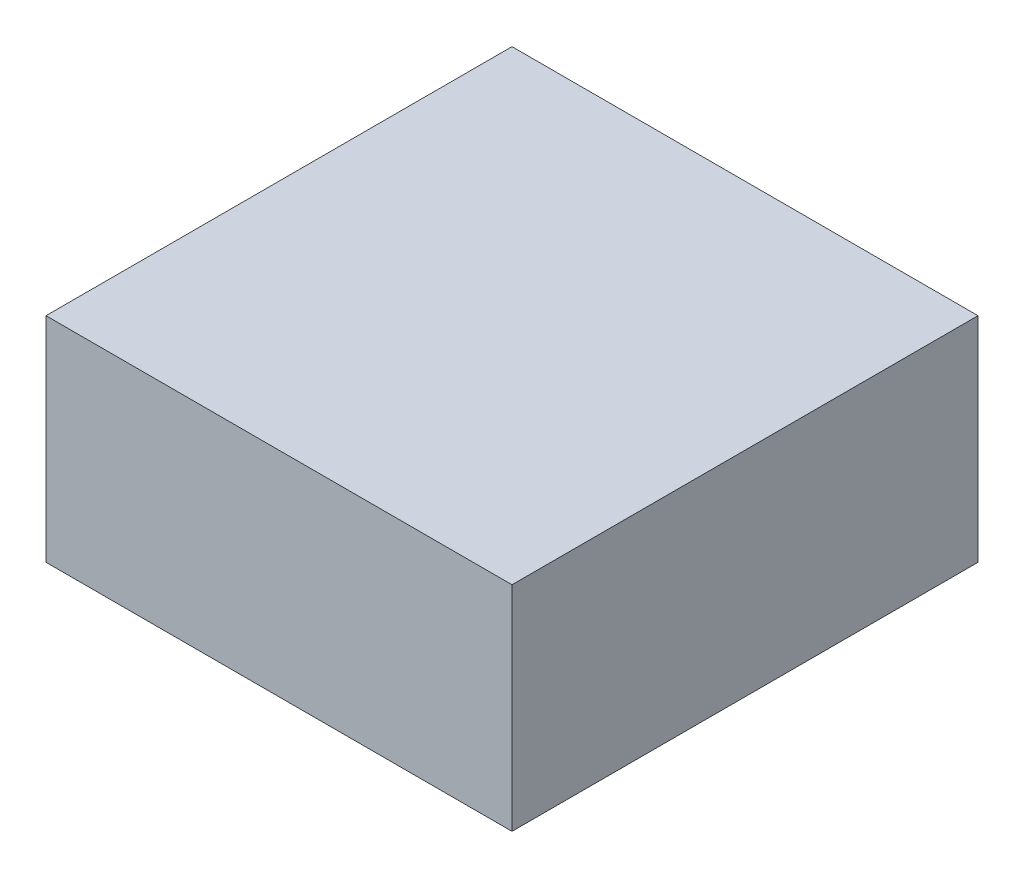
ISO-10303-21;
HEADER;
FILE_DESCRIPTION(('STEP AP214'),'2;1');
FILE_NAME('part.step','',(''),(''),'','','');
FILE_SCHEMA(('AUTOMOTIVE_DESIGN { 1 0 10303 214 1 1 1 1 }'));
ENDSEC;
DATA;
#1=APPLICATION_CONTEXT('core data for automotive mechanical design processes');
#2=APPLICATION_PROTOCOL_DEFINITION('international standard','automotive_design',2000,#1);
#3=PRODUCT_CONTEXT('',#1,'mechanical');
#4=PRODUCT('Part','Part','',(#3));
#5=PRODUCT_RELATED_PRODUCT_CATEGORY('part','',(#4));
#6=PRODUCT_DEFINITION_FORMATION('','',#4);
#7=PRODUCT_DEFINITION_CONTEXT('part definition',#1,'design');
#8=PRODUCT_DEFINITION('design','',#6,#7);
#9=PRODUCT_DEFINITION_SHAPE('','',#8);
#10=(LENGTH_UNIT() NAMED_UNIT(*) SI_UNIT(.MILLI.,.METRE.));
#11=(NAMED_UNIT(*) PLANE_ANGLE_UNIT() SI_UNIT($,.RADIAN.));
#12=(NAMED_UNIT(*) SI_UNIT($,.STERADIAN.) SOLID_ANGLE_UNIT());
#13=UNCERTAINTY_MEASURE_WITH_UNIT(LENGTH_MEASURE(1.E-05),#10,'distance_accuracy_value','');
#14=(GEOMETRIC_REPRESENTATION_CONTEXT(3) GLOBAL_UNCERTAINTY_ASSIGNED_CONTEXT((#13)) GLOBAL_UNIT_ASSIGNED_CONTEXT((#10,
#11,#12)) REPRESENTATION_CONTEXT('',''));
#15=CARTESIAN_POINT('',(0.,0.,0.));
#16=DIRECTION('',(0.,0.,1.));
#17=DIRECTION('',(1.,0.,0.));
#18=AXIS2_PLACEMENT_3D('',#15,#16,#17);
#19=CARTESIAN_POINT('',(0.,-2.7,0.));
#20=DIRECTION('',(0.,1.,0.));
#21=DIRECTION('',(0.,0.,1.));
#22=AXIS2_PLACEMENT_3D('',#19,#20,#21);
#23=PLANE('',#22);
#24=DIRECTION('',(-1.,0.,0.));
#25=VECTOR('',#24,1.);
#26=CARTESIAN_POINT('',(1.9,-2.7,1.9));
#27=LINE('',#26,#25);
#28=CARTESIAN_POINT('',(2.4,-2.7,1.9));
#29=VERTEX_POINT('',#28);
#30=CARTESIAN_POINT('',(1.9,-2.7,1.9));
#31=VERTEX_POINT('',#30);
#32=EDGE_CURVE('E63',#29,#31,#27,.T.);
#33=ORIENTED_EDGE('',*,*,#32,.F.);
#34=DIRECTION('',(0.,0.,1.));
#35=VECTOR('',#34,1.);
#36=CARTESIAN_POINT('',(2.4,-2.7,2.4));
#37=LINE('',#36,#35);
#38=CARTESIAN_POINT('',(2.4,-2.7,2.4));
#39=VERTEX_POINT('',#38);
#40=EDGE_CURVE('E237',#29,#39,#37,.T.);
#41=ORIENTED_EDGE('',*,*,#40,.T.);
#42=DIRECTION('',(-1.,0.,0.));
#43=VECTOR('',#42,1.);
#44=CARTESIAN_POINT('',(-2.4,-2.7,2.4));
#45=LINE('',#44,#43);
#46=CARTESIAN_POINT('',(-2.4,-2.7,2.4));
#47=VERTEX_POINT('',#46);
#48=EDGE_CURVE('E238',#39,#47,#45,.T.);
#49=ORIENTED_EDGE('',*,*,#48,.T.);
#50=DIRECTION('',(0.,0.,-1.));
#51=VECTOR('',#50,1.);
#52=CARTESIAN_POINT('',(-2.4,-2.7,-2.4));
#53=LINE('',#52,#51);
#54=CARTESIAN_POINT('',(-2.4,-2.7,1.9));
#55=VERTEX_POINT('',#54);
#56=EDGE_CURVE('E241',#47,#55,#53,.T.);
#57=ORIENTED_EDGE('',*,*,#56,.T.);
#58=DIRECTION('',(-1.,0.,0.));
#59=VECTOR('',#58,1.);
#60=CARTESIAN_POINT('',(-2.4,-2.7,1.9));
#61=LINE('',#60,#59);
#62=CARTESIAN_POINT('',(-1.9,-2.7,1.9));
#63=VERTEX_POINT('',#62);
#64=EDGE_CURVE('E209',#63,#55,#61,.T.);
#65=ORIENTED_EDGE('',*,*,#64,.F.);
#66=DIRECTION('',(0.,0.,1.));
#67=VECTOR('',#66,1.);
#68=CARTESIAN_POINT('',(-1.9,-2.7,1.9));
#69=LINE('',#68,#67);
#70=CARTESIAN_POINT('',(-1.9,-2.7,-1.9));
#71=VERTEX_POINT('',#70);
#72=EDGE_CURVE('E199',#71,#63,#69,.T.);
#73=ORIENTED_EDGE('',*,*,#72,.F.);
#74=DIRECTION('',(1.,0.,0.));
#75=VECTOR('',#74,1.);
#76=CARTESIAN_POINT('',(-1.9,-2.7,-1.9));
#77=LINE('',#76,#75);
#78=CARTESIAN_POINT('',(-2.4,-2.7,-1.9));
#79=VERTEX_POINT('',#78);
#80=EDGE_CURVE('E197',#79,#71,#77,.T.);
#81=ORIENTED_EDGE('',*,*,#80,.F.);
#82=CARTESIAN_POINT('',(-2.4,-2.7,-2.4));
#83=VERTEX_POINT('',#82);
#84=EDGE_CURVE('E245',#79,#83,#53,.T.);
#85=ORIENTED_EDGE('',*,*,#84,.T.);
#86=DIRECTION('',(1.,0.,0.));
#87=VECTOR('',#86,1.);
#88=CARTESIAN_POINT('',(2.4,-2.7,-2.4));
#89=LINE('',#88,#87);
#90=CARTESIAN_POINT('',(2.4,-2.7,-2.4));
#91=VERTEX_POINT('',#90);
#92=EDGE_CURVE('E235',#83,#91,#89,.T.);
#93=ORIENTED_EDGE('',*,*,#92,.T.);
#94=CARTESIAN_POINT('',(2.4,-2.7,-1.9));
#95=VERTEX_POINT('',#94);
#96=EDGE_CURVE('E236',#91,#95,#37,.T.);
#97=ORIENTED_EDGE('',*,*,#96,.T.);
#98=DIRECTION('',(1.,0.,0.));
#99=VECTOR('',#98,1.);
#100=CARTESIAN_POINT('',(2.4,-2.7,-1.9));
#101=LINE('',#100,#99);
#102=CARTESIAN_POINT('',(1.9,-2.7,-1.9));
#103=VERTEX_POINT('',#102);
#104=EDGE_CURVE('E191',#103,#95,#101,.T.);
#105=ORIENTED_EDGE('',*,*,#104,.F.);
#106=DIRECTION('',(0.,0.,-1.));
#107=VECTOR('',#106,1.);
#108=CARTESIAN_POINT('',(1.9,-2.7,-1.9));
#109=LINE('',#108,#107);
#110=EDGE_CURVE('E57',#31,#103,#109,.T.);
#111=ORIENTED_EDGE('',*,*,#110,.F.);
#112=EDGE_LOOP('',(#33,#41,#49,#57,#65,#73,#81,#85,#93,#97,#105,#111));
#113=FACE_BOUND('',#112,.T.);
#114=ADVANCED_FACE('F39',(#113),#23,.F.);
#115=CARTESIAN_POINT('',(0.,-0.5,0.));
#116=DIRECTION('',(0.,-1.,0.));
#117=DIRECTION('',(0.,0.,-1.));
#118=AXIS2_PLACEMENT_3D('',#115,#116,#117);
#119=PLANE('',#118);
#120=DIRECTION('',(0.,0.,1.));
#121=VECTOR('',#120,1.);
#122=CARTESIAN_POINT('',(5.5,-0.5,-5.5));
#123=LINE('',#122,#121);
#124=CARTESIAN_POINT('',(5.5,-0.5,-5.5));
#125=VERTEX_POINT('',#124);
#126=CARTESIAN_POINT('',(5.5,-0.5,5.5));
#127=VERTEX_POINT('',#126);
#128=EDGE_CURVE('E262',#125,#127,#123,.T.);
#129=ORIENTED_EDGE('',*,*,#128,.T.);
#130=DIRECTION('',(-1.,0.,0.));
#131=VECTOR('',#130,1.);
#132=CARTESIAN_POINT('',(5.5,-0.5,5.5));
#133=LINE('',#132,#131);
#134=CARTESIAN_POINT('',(-5.5,-0.5,5.5));
#135=VERTEX_POINT('',#134);
#136=EDGE_CURVE('E270',#127,#135,#133,.T.);
#137=ORIENTED_EDGE('',*,*,#136,.T.);
#138=DIRECTION('',(0.,0.,-1.));
#139=VECTOR('',#138,1.);
#140=CARTESIAN_POINT('',(-5.5,-0.5,5.5));
#141=LINE('',#140,#139);
#142=CARTESIAN_POINT('',(-5.5,-0.5,-5.5));
#143=VERTEX_POINT('',#142);
#144=EDGE_CURVE('E271',#135,#143,#141,.T.);
#145=ORIENTED_EDGE('',*,*,#144,.T.);
#146=DIRECTION('',(1.,0.,0.));
#147=VECTOR('',#146,1.);
#148=CARTESIAN_POINT('',(-5.5,-0.5,-5.5));
#149=LINE('',#148,#147);
#150=EDGE_CURVE('E273',#143,#125,#149,.T.);
#151=ORIENTED_EDGE('',*,*,#150,.T.);
#152=EDGE_LOOP('',(#129,#137,#145,#151));
#153=FACE_BOUND('',#152,.T.);
#154=DIRECTION('',(0.,0.,1.));
#155=VECTOR('',#154,1.);
#156=CARTESIAN_POINT('',(2.4,-0.5,2.4));
#157=LINE('',#156,#155);
#158=CARTESIAN_POINT('',(2.4,-0.5,-2.4));
#159=VERTEX_POINT('',#158);
#160=CARTESIAN_POINT('',(2.4,-0.5,2.4));
#161=VERTEX_POINT('',#160);
#162=EDGE_CURVE('E250',#159,#161,#157,.T.);
#163=ORIENTED_EDGE('',*,*,#162,.F.);
#164=DIRECTION('',(1.,0.,0.));
#165=VECTOR('',#164,1.);
#166=CARTESIAN_POINT('',(2.4,-0.5,-2.4));
#167=LINE('',#166,#165);
#168=CARTESIAN_POINT('',(-2.4,-0.5,-2.4));
#169=VERTEX_POINT('',#168);
#170=EDGE_CURVE('E234',#169,#159,#167,.T.);
#171=ORIENTED_EDGE('',*,*,#170,.F.);
#172=DIRECTION('',(0.,0.,-1.));
#173=VECTOR('',#172,1.);
#174=CARTESIAN_POINT('',(-2.4,-0.5,-2.4));
#175=LINE('',#174,#173);
#176=CARTESIAN_POINT('',(-2.4,-0.5,2.4));
#177=VERTEX_POINT('',#176);
#178=EDGE_CURVE('E240',#177,#169,#175,.T.);
#179=ORIENTED_EDGE('',*,*,#178,.F.);
#180=DIRECTION('',(-1.,0.,0.));
#181=VECTOR('',#180,1.);
#182=CARTESIAN_POINT('',(-2.4,-0.5,2.4));
#183=LINE('',#182,#181);
#184=EDGE_CURVE('E248',#161,#177,#183,.T.);
#185=ORIENTED_EDGE('',*,*,#184,.F.);
#186=EDGE_LOOP('',(#163,#171,#179,#185));
#187=FACE_BOUND('',#186,.T.);
#188=ADVANCED_FACE('F350',(#153,#187),#119,.T.);
#189=CARTESIAN_POINT('',(6.,-5.5,-6.));
#190=DIRECTION('',(0.,0.,-1.));
#191=DIRECTION('',(-1.,0.,0.));
#192=AXIS2_PLACEMENT_3D('',#189,#190,#191);
#193=PLANE('',#192);
#194=DIRECTION('',(-1.,0.,0.));
#195=VECTOR('',#194,1.);
#196=CARTESIAN_POINT('',(6.,0.,-6.));
#197=LINE('',#196,#195);
#198=CARTESIAN_POINT('',(6.,0.,-6.));
#199=VERTEX_POINT('',#198);
#200=CARTESIAN_POINT('',(-6.,0.,-6.));
#201=VERTEX_POINT('',#200);
#202=EDGE_CURVE('E286',#199,#201,#197,.T.);
#203=ORIENTED_EDGE('',*,*,#202,.F.);
#204=DIRECTION('',(0.,1.,0.));
#205=VECTOR('',#204,1.);
#206=CARTESIAN_POINT('',(6.,-5.5,-6.));
#207=LINE('',#206,#205);
#208=CARTESIAN_POINT('',(6.,-5.5,-6.));
#209=VERTEX_POINT('',#208);
#210=EDGE_CURVE('E11',#209,#199,#207,.T.);
#211=ORIENTED_EDGE('',*,*,#210,.F.);
#212=DIRECTION('',(-1.,0.,0.));
#213=VECTOR('',#212,1.);
#214=CARTESIAN_POINT('',(6.,-5.5,-6.));
#215=LINE('',#214,#213);
#216=CARTESIAN_POINT('',(-6.,-5.5,-6.));
#217=VERTEX_POINT('',#216);
#218=EDGE_CURVE('E298',#209,#217,#215,.T.);
#219=ORIENTED_EDGE('',*,*,#218,.T.);
#220=DIRECTION('',(0.,1.,0.));
#221=VECTOR('',#220,1.);
#222=CARTESIAN_POINT('',(-6.,-5.5,-6.));
#223=LINE('',#222,#221);
#224=EDGE_CURVE('E43',#217,#201,#223,.T.);
#225=ORIENTED_EDGE('',*,*,#224,.T.);
#226=EDGE_LOOP('',(#203,#211,#219,#225));
#227=FACE_BOUND('',#226,.T.);
#228=ADVANCED_FACE('F41',(#227),#193,.T.);
#229=CARTESIAN_POINT('',(6.,-5.5,6.));
#230=DIRECTION('',(1.,0.,0.));
#231=DIRECTION('',(0.,0.,-1.));
#232=AXIS2_PLACEMENT_3D('',#229,#230,#231);
#233=PLANE('',#232);
#234=DIRECTION('',(0.,0.,-1.));
#235=VECTOR('',#234,1.);
#236=CARTESIAN_POINT('',(6.,0.,6.));
#237=LINE('',#236,#235);
#238=CARTESIAN_POINT('',(6.,0.,6.));
#239=VERTEX_POINT('',#238);
#240=EDGE_CURVE('E297',#239,#199,#237,.T.);
#241=ORIENTED_EDGE('',*,*,#240,.F.);
#242=DIRECTION('',(0.,1.,0.));
#243=VECTOR('',#242,1.);
#244=CARTESIAN_POINT('',(6.,-5.5,6.));
#245=LINE('',#244,#243);
#246=CARTESIAN_POINT('',(6.,-5.5,6.));
#247=VERTEX_POINT('',#246);
#248=EDGE_CURVE('E48',#247,#239,#245,.T.);
#249=ORIENTED_EDGE('',*,*,#248,.F.);
#250=DIRECTION('',(0.,0.,-1.));
#251=VECTOR('',#250,1.);
#252=CARTESIAN_POINT('',(6.,-5.5,6.));
#253=LINE('',#252,#251);
#254=EDGE_CURVE('E308',#247,#209,#253,.T.);
#255=ORIENTED_EDGE('',*,*,#254,.T.);
#256=ORIENTED_EDGE('',*,*,#210,.T.);
#257=EDGE_LOOP('',(#241,#249,#255,#256));
#258=FACE_BOUND('',#257,.T.);
#259=ADVANCED_FACE('F335',(#258),#233,.T.);
#260=CARTESIAN_POINT('',(-6.,-5.5,6.));
#261=DIRECTION('',(0.,0.,1.));
#262=DIRECTION('',(1.,0.,0.));
#263=AXIS2_PLACEMENT_3D('',#260,#261,#262);
#264=PLANE('',#263);
#265=DIRECTION('',(1.,0.,0.));
#266=VECTOR('',#265,1.);
#267=CARTESIAN_POINT('',(-6.,0.,6.));
#268=LINE('',#267,#266);
#269=CARTESIAN_POINT('',(-6.,0.,6.));
#270=VERTEX_POINT('',#269);
#271=EDGE_CURVE('E314',#270,#239,#268,.T.);
#272=ORIENTED_EDGE('',*,*,#271,.F.);
#273=DIRECTION('',(0.,1.,0.));
#274=VECTOR('',#273,1.);
#275=CARTESIAN_POINT('',(-6.,-5.5,6.));
#276=LINE('',#275,#274);
#277=CARTESIAN_POINT('',(-6.,-5.5,6.));
#278=VERTEX_POINT('',#277);
#279=EDGE_CURVE('E317',#278,#270,#276,.T.);
#280=ORIENTED_EDGE('',*,*,#279,.F.);
#281=DIRECTION('',(1.,0.,0.));
#282=VECTOR('',#281,1.);
#283=CARTESIAN_POINT('',(-6.,-5.5,6.));
#284=LINE('',#283,#282);
#285=EDGE_CURVE('E305',#278,#247,#284,.T.);
#286=ORIENTED_EDGE('',*,*,#285,.T.);
#287=ORIENTED_EDGE('',*,*,#248,.T.);
#288=EDGE_LOOP('',(#272,#280,#286,#287));
#289=FACE_BOUND('',#288,.T.);
#290=ADVANCED_FACE('F336',(#289),#264,.T.);
#291=CARTESIAN_POINT('',(-6.,-5.5,-6.));
#292=DIRECTION('',(-1.,0.,0.));
#293=DIRECTION('',(0.,0.,1.));
#294=AXIS2_PLACEMENT_3D('',#291,#292,#293);
#295=PLANE('',#294);
#296=DIRECTION('',(0.,0.,1.));
#297=VECTOR('',#296,1.);
#298=CARTESIAN_POINT('',(-6.,0.,-6.));
#299=LINE('',#298,#297);
#300=EDGE_CURVE('E313',#201,#270,#299,.T.);
#301=ORIENTED_EDGE('',*,*,#300,.F.);
#302=ORIENTED_EDGE('',*,*,#224,.F.);
#303=DIRECTION('',(0.,0.,1.));
#304=VECTOR('',#303,1.);
#305=CARTESIAN_POINT('',(-6.,-5.5,-6.));
#306=LINE('',#305,#304);
#307=EDGE_CURVE('E299',#217,#278,#306,.T.);
#308=ORIENTED_EDGE('',*,*,#307,.T.);
#309=ORIENTED_EDGE('',*,*,#279,.T.);
#310=EDGE_LOOP('',(#301,#302,#308,#309));
#311=FACE_BOUND('',#310,.T.);
#312=ADVANCED_FACE('F330',(#311),#295,.T.);
#313=CARTESIAN_POINT('',(0.,-5.5,0.));
#314=DIRECTION('',(0.,1.,0.));
#315=DIRECTION('',(0.,0.,1.));
#316=AXIS2_PLACEMENT_3D('',#313,#314,#315);
#317=PLANE('',#316);
#318=DIRECTION('',(-1.,0.,0.));
#319=VECTOR('',#318,1.);
#320=CARTESIAN_POINT('',(5.5,-5.5,5.5));
#321=LINE('',#320,#319);
#322=CARTESIAN_POINT('',(5.5,-5.5,5.5));
#323=VERTEX_POINT('',#322);
#324=CARTESIAN_POINT('',(-5.5,-5.5,5.5));
#325=VERTEX_POINT('',#324);
#326=EDGE_CURVE('E276',#323,#325,#321,.T.);
#327=ORIENTED_EDGE('',*,*,#326,.F.);
#328=DIRECTION('',(0.,0.,1.));
#329=VECTOR('',#328,1.);
#330=CARTESIAN_POINT('',(5.5,-5.5,-5.5));
#331=LINE('',#330,#329);
#332=CARTESIAN_POINT('',(5.5,-5.5,-5.5));
#333=VERTEX_POINT('',#332);
#334=EDGE_CURVE('E263',#333,#323,#331,.T.);
#335=ORIENTED_EDGE('',*,*,#334,.F.);
#336=DIRECTION('',(1.,0.,0.));
#337=VECTOR('',#336,1.);
#338=CARTESIAN_POINT('',(-5.5,-5.5,-5.5));
#339=LINE('',#338,#337);
#340=CARTESIAN_POINT('',(-5.5,-5.5,-5.5));
#341=VERTEX_POINT('',#340);
#342=EDGE_CURVE('E268',#341,#333,#339,.T.);
#343=ORIENTED_EDGE('',*,*,#342,.F.);
#344=DIRECTION('',(0.,0.,-1.));
#345=VECTOR('',#344,1.);
#346=CARTESIAN_POINT('',(-5.5,-5.5,5.5));
#347=LINE('',#346,#345);
#348=EDGE_CURVE('E285',#325,#341,#347,.T.);
#349=ORIENTED_EDGE('',*,*,#348,.F.);
#350=EDGE_LOOP('',(#327,#335,#343,#349));
#351=FACE_BOUND('',#350,.T.);
#352=ORIENTED_EDGE('',*,*,#218,.F.);
#353=ORIENTED_EDGE('',*,*,#254,.F.);
#354=ORIENTED_EDGE('',*,*,#285,.F.);
#355=ORIENTED_EDGE('',*,*,#307,.F.);
#356=EDGE_LOOP('',(#352,#353,#354,#355));
#357=FACE_BOUND('',#356,.T.);
#358=ADVANCED_FACE('F333',(#351,#357),#317,.F.);
#359=CARTESIAN_POINT('',(0.,0.,0.));
#360=DIRECTION('',(0.,1.,0.));
#361=DIRECTION('',(0.,0.,1.));
#362=AXIS2_PLACEMENT_3D('',#359,#360,#361);
#363=PLANE('',#362);
#364=ORIENTED_EDGE('',*,*,#202,.T.);
#365=ORIENTED_EDGE('',*,*,#300,.T.);
#366=ORIENTED_EDGE('',*,*,#271,.T.);
#367=ORIENTED_EDGE('',*,*,#240,.T.);
#368=EDGE_LOOP('',(#364,#365,#366,#367));
#369=FACE_BOUND('',#368,.T.);
#370=ADVANCED_FACE('F328',(#369),#363,.T.);
#371=CARTESIAN_POINT('',(5.5,-0.5,-5.5));
#372=DIRECTION('',(1.,0.,0.));
#373=DIRECTION('',(0.,0.,-1.));
#374=AXIS2_PLACEMENT_3D('',#371,#372,#373);
#375=PLANE('',#374);
#376=ORIENTED_EDGE('',*,*,#334,.T.);
#377=DIRECTION('',(0.,-1.,0.));
#378=VECTOR('',#377,1.);
#379=CARTESIAN_POINT('',(5.5,-0.5,5.5));
#380=LINE('',#379,#378);
#381=EDGE_CURVE('E280',#127,#323,#380,.T.);
#382=ORIENTED_EDGE('',*,*,#381,.F.);
#383=ORIENTED_EDGE('',*,*,#128,.F.);
#384=DIRECTION('',(0.,-1.,0.));
#385=VECTOR('',#384,1.);
#386=CARTESIAN_POINT('',(5.5,-0.5,-5.5));
#387=LINE('',#386,#385);
#388=EDGE_CURVE('E289',#125,#333,#387,.T.);
#389=ORIENTED_EDGE('',*,*,#388,.T.);
#390=EDGE_LOOP('',(#376,#382,#383,#389));
#391=FACE_BOUND('',#390,.T.);
#392=ADVANCED_FACE('F379',(#391),#375,.F.);
#393=CARTESIAN_POINT('',(-5.5,-0.5,-5.5));
#394=DIRECTION('',(0.,0.,-1.));
#395=DIRECTION('',(-1.,0.,0.));
#396=AXIS2_PLACEMENT_3D('',#393,#394,#395);
#397=PLANE('',#396);
#398=ORIENTED_EDGE('',*,*,#342,.T.);
#399=ORIENTED_EDGE('',*,*,#388,.F.);
#400=ORIENTED_EDGE('',*,*,#150,.F.);
#401=DIRECTION('',(0.,-1.,0.));
#402=VECTOR('',#401,1.);
#403=CARTESIAN_POINT('',(-5.5,-0.5,-5.5));
#404=LINE('',#403,#402);
#405=EDGE_CURVE('E288',#143,#341,#404,.T.);
#406=ORIENTED_EDGE('',*,*,#405,.T.);
#407=EDGE_LOOP('',(#398,#399,#400,#406));
#408=FACE_BOUND('',#407,.T.);
#409=ADVANCED_FACE('F376',(#408),#397,.F.);
#410=CARTESIAN_POINT('',(-5.5,-0.5,5.5));
#411=DIRECTION('',(-1.,0.,0.));
#412=DIRECTION('',(0.,0.,1.));
#413=AXIS2_PLACEMENT_3D('',#410,#411,#412);
#414=PLANE('',#413);
#415=ORIENTED_EDGE('',*,*,#348,.T.);
#416=ORIENTED_EDGE('',*,*,#405,.F.);
#417=ORIENTED_EDGE('',*,*,#144,.F.);
#418=DIRECTION('',(0.,-1.,0.));
#419=VECTOR('',#418,1.);
#420=CARTESIAN_POINT('',(-5.5,-0.5,5.5));
#421=LINE('',#420,#419);
#422=EDGE_CURVE('E295',#135,#325,#421,.T.);
#423=ORIENTED_EDGE('',*,*,#422,.T.);
#424=EDGE_LOOP('',(#415,#416,#417,#423));
#425=FACE_BOUND('',#424,.T.);
#426=ADVANCED_FACE('F377',(#425),#414,.F.);
#427=CARTESIAN_POINT('',(5.5,-0.5,5.5));
#428=DIRECTION('',(0.,0.,1.));
#429=DIRECTION('',(1.,0.,0.));
#430=AXIS2_PLACEMENT_3D('',#427,#428,#429);
#431=PLANE('',#430);
#432=ORIENTED_EDGE('',*,*,#326,.T.);
#433=ORIENTED_EDGE('',*,*,#422,.F.);
#434=ORIENTED_EDGE('',*,*,#136,.F.);
#435=ORIENTED_EDGE('',*,*,#381,.T.);
#436=EDGE_LOOP('',(#432,#433,#434,#435));
#437=FACE_BOUND('',#436,.T.);
#438=ADVANCED_FACE('F373',(#437),#431,.F.);
#439=CARTESIAN_POINT('',(2.4,-2.7,-2.4));
#440=DIRECTION('',(0.,0.,1.));
#441=DIRECTION('',(1.,0.,0.));
#442=AXIS2_PLACEMENT_3D('',#439,#440,#441);
#443=PLANE('',#442);
#444=ORIENTED_EDGE('',*,*,#170,.T.);
#445=DIRECTION('',(0.,1.,0.));
#446=VECTOR('',#445,1.);
#447=CARTESIAN_POINT('',(2.4,-2.7,-2.4));
#448=LINE('',#447,#446);
#449=EDGE_CURVE('E261',#91,#159,#448,.T.);
#450=ORIENTED_EDGE('',*,*,#449,.F.);
#451=ORIENTED_EDGE('',*,*,#92,.F.);
#452=DIRECTION('',(0.,1.,0.));
#453=VECTOR('',#452,1.);
#454=CARTESIAN_POINT('',(-2.4,-2.7,-2.4));
#455=LINE('',#454,#453);
#456=EDGE_CURVE('E242',#83,#169,#455,.T.);
#457=ORIENTED_EDGE('',*,*,#456,.T.);
#458=EDGE_LOOP('',(#444,#450,#451,#457));
#459=FACE_BOUND('',#458,.T.);
#460=ADVANCED_FACE('F367',(#459),#443,.F.);
#461=CARTESIAN_POINT('',(2.4,-2.7,2.4));
#462=DIRECTION('',(-1.,0.,0.));
#463=DIRECTION('',(0.,0.,1.));
#464=AXIS2_PLACEMENT_3D('',#461,#462,#463);
#465=PLANE('',#464);
#466=ORIENTED_EDGE('',*,*,#162,.T.);
#467=DIRECTION('',(0.,1.,0.));
#468=VECTOR('',#467,1.);
#469=CARTESIAN_POINT('',(2.4,-2.7,2.4));
#470=LINE('',#469,#468);
#471=EDGE_CURVE('E256',#39,#161,#470,.T.);
#472=ORIENTED_EDGE('',*,*,#471,.F.);
#473=ORIENTED_EDGE('',*,*,#40,.F.);
#474=DIRECTION('',(0.,1.,0.));
#475=VECTOR('',#474,1.);
#476=CARTESIAN_POINT('',(2.4,-5.5,1.9));
#477=LINE('',#476,#475);
#478=CARTESIAN_POINT('',(2.4,-5.5,1.9));
#479=VERTEX_POINT('',#478);
#480=EDGE_CURVE('E530',#479,#29,#477,.T.);
#481=ORIENTED_EDGE('',*,*,#480,.F.);
#482=DIRECTION('',(0.,0.,1.));
#483=VECTOR('',#482,1.);
#484=CARTESIAN_POINT('',(2.4,-5.5,1.9));
#485=LINE('',#484,#483);
#486=CARTESIAN_POINT('',(2.4,-5.5,-1.9));
#487=VERTEX_POINT('',#486);
#488=EDGE_CURVE('E187',#487,#479,#485,.T.);
#489=ORIENTED_EDGE('',*,*,#488,.F.);
#490=DIRECTION('',(0.,1.,0.));
#491=VECTOR('',#490,1.);
#492=CARTESIAN_POINT('',(2.4,-5.5,-1.9));
#493=LINE('',#492,#491);
#494=EDGE_CURVE('E205',#487,#95,#493,.T.);
#495=ORIENTED_EDGE('',*,*,#494,.T.);
#496=ORIENTED_EDGE('',*,*,#96,.F.);
#497=ORIENTED_EDGE('',*,*,#449,.T.);
#498=EDGE_LOOP('',(#466,#472,#473,#481,#489,#495,#496,#497));
#499=FACE_BOUND('',#498,.T.);
#500=ADVANCED_FACE('F370',(#499),#465,.F.);
#501=CARTESIAN_POINT('',(-2.4,-2.7,2.4));
#502=DIRECTION('',(0.,0.,-1.));
#503=DIRECTION('',(-1.,0.,0.));
#504=AXIS2_PLACEMENT_3D('',#501,#502,#503);
#505=PLANE('',#504);
#506=ORIENTED_EDGE('',*,*,#184,.T.);
#507=DIRECTION('',(0.,1.,0.));
#508=VECTOR('',#507,1.);
#509=CARTESIAN_POINT('',(-2.4,-2.7,2.4));
#510=LINE('',#509,#508);
#511=EDGE_CURVE('E258',#47,#177,#510,.T.);
#512=ORIENTED_EDGE('',*,*,#511,.F.);
#513=ORIENTED_EDGE('',*,*,#48,.F.);
#514=ORIENTED_EDGE('',*,*,#471,.T.);
#515=EDGE_LOOP('',(#506,#512,#513,#514));
#516=FACE_BOUND('',#515,.T.);
#517=ADVANCED_FACE('F361',(#516),#505,.F.);
#518=CARTESIAN_POINT('',(-2.4,-2.7,-2.4));
#519=DIRECTION('',(1.,0.,0.));
#520=DIRECTION('',(0.,0.,-1.));
#521=AXIS2_PLACEMENT_3D('',#518,#519,#520);
#522=PLANE('',#521);
#523=ORIENTED_EDGE('',*,*,#178,.T.);
#524=ORIENTED_EDGE('',*,*,#456,.F.);
#525=ORIENTED_EDGE('',*,*,#84,.F.);
#526=DIRECTION('',(0.,1.,0.));
#527=VECTOR('',#526,1.);
#528=CARTESIAN_POINT('',(-2.4,-5.5,-1.9));
#529=LINE('',#528,#527);
#530=CARTESIAN_POINT('',(-2.4,-5.5,-1.9));
#531=VERTEX_POINT('',#530);
#532=EDGE_CURVE('E214',#531,#79,#529,.T.);
#533=ORIENTED_EDGE('',*,*,#532,.F.);
#534=DIRECTION('',(0.,0.,-1.));
#535=VECTOR('',#534,1.);
#536=CARTESIAN_POINT('',(-2.4,-5.5,-1.9));
#537=LINE('',#536,#535);
#538=CARTESIAN_POINT('',(-2.4,-5.5,1.9));
#539=VERTEX_POINT('',#538);
#540=EDGE_CURVE('E212',#539,#531,#537,.T.);
#541=ORIENTED_EDGE('',*,*,#540,.F.);
#542=DIRECTION('',(0.,1.,0.));
#543=VECTOR('',#542,1.);
#544=CARTESIAN_POINT('',(-2.4,-5.5,1.9));
#545=LINE('',#544,#543);
#546=EDGE_CURVE('E224',#539,#55,#545,.T.);
#547=ORIENTED_EDGE('',*,*,#546,.T.);
#548=ORIENTED_EDGE('',*,*,#56,.F.);
#549=ORIENTED_EDGE('',*,*,#511,.T.);
#550=EDGE_LOOP('',(#523,#524,#525,#533,#541,#547,#548,#549));
#551=FACE_BOUND('',#550,.T.);
#552=ADVANCED_FACE('F358',(#551),#522,.F.);
#553=CARTESIAN_POINT('',(-1.9,-5.5,-1.9));
#554=DIRECTION('',(0.,0.,1.));
#555=DIRECTION('',(1.,0.,0.));
#556=AXIS2_PLACEMENT_3D('',#553,#554,#555);
#557=PLANE('',#556);
#558=ORIENTED_EDGE('',*,*,#80,.T.);
#559=DIRECTION('',(0.,1.,0.));
#560=VECTOR('',#559,1.);
#561=CARTESIAN_POINT('',(-1.9,-5.5,-1.9));
#562=LINE('',#561,#560);
#563=CARTESIAN_POINT('',(-1.9,-5.5,-1.9));
#564=VERTEX_POINT('',#563);
#565=EDGE_CURVE('E229',#564,#71,#562,.T.);
#566=ORIENTED_EDGE('',*,*,#565,.F.);
#567=DIRECTION('',(1.,0.,0.));
#568=VECTOR('',#567,1.);
#569=CARTESIAN_POINT('',(-1.9,-5.5,-1.9));
#570=LINE('',#569,#568);
#571=EDGE_CURVE('E206',#531,#564,#570,.T.);
#572=ORIENTED_EDGE('',*,*,#571,.F.);
#573=ORIENTED_EDGE('',*,*,#532,.T.);
#574=EDGE_LOOP('',(#558,#566,#572,#573));
#575=FACE_BOUND('',#574,.T.);
#576=ADVANCED_FACE('F360',(#575),#557,.F.);
#577=CARTESIAN_POINT('',(-1.9,-5.5,1.9));
#578=DIRECTION('',(-1.,0.,0.));
#579=DIRECTION('',(0.,0.,1.));
#580=AXIS2_PLACEMENT_3D('',#577,#578,#579);
#581=PLANE('',#580);
#582=ORIENTED_EDGE('',*,*,#72,.T.);
#583=DIRECTION('',(0.,1.,0.));
#584=VECTOR('',#583,1.);
#585=CARTESIAN_POINT('',(-1.9,-5.5,1.9));
#586=LINE('',#585,#584);
#587=CARTESIAN_POINT('',(-1.9,-5.5,1.9));
#588=VERTEX_POINT('',#587);
#589=EDGE_CURVE('E228',#588,#63,#586,.T.);
#590=ORIENTED_EDGE('',*,*,#589,.F.);
#591=DIRECTION('',(0.,0.,1.));
#592=VECTOR('',#591,1.);
#593=CARTESIAN_POINT('',(-1.9,-5.5,1.9));
#594=LINE('',#593,#592);
#595=EDGE_CURVE('E207',#564,#588,#594,.T.);
#596=ORIENTED_EDGE('',*,*,#595,.F.);
#597=ORIENTED_EDGE('',*,*,#565,.T.);
#598=EDGE_LOOP('',(#582,#590,#596,#597));
#599=FACE_BOUND('',#598,.T.);
#600=ADVANCED_FACE('F452',(#599),#581,.F.);
#601=CARTESIAN_POINT('',(-2.4,-5.5,1.9));
#602=DIRECTION('',(0.,0.,-1.));
#603=DIRECTION('',(-1.,0.,0.));
#604=AXIS2_PLACEMENT_3D('',#601,#602,#603);
#605=PLANE('',#604);
#606=ORIENTED_EDGE('',*,*,#64,.T.);
#607=ORIENTED_EDGE('',*,*,#546,.F.);
#608=DIRECTION('',(-1.,0.,0.));
#609=VECTOR('',#608,1.);
#610=CARTESIAN_POINT('',(-2.4,-5.5,1.9));
#611=LINE('',#610,#609);
#612=EDGE_CURVE('E215',#588,#539,#611,.T.);
#613=ORIENTED_EDGE('',*,*,#612,.F.);
#614=ORIENTED_EDGE('',*,*,#589,.T.);
#615=EDGE_LOOP('',(#606,#607,#613,#614));
#616=FACE_BOUND('',#615,.T.);
#617=ADVANCED_FACE('F459',(#616),#605,.F.);
#618=CARTESIAN_POINT('',(0.,-5.5,0.));
#619=DIRECTION('',(0.,1.,0.));
#620=DIRECTION('',(0.,0.,1.));
#621=AXIS2_PLACEMENT_3D('',#618,#619,#620);
#622=PLANE('',#621);
#623=ORIENTED_EDGE('',*,*,#571,.T.);
#624=ORIENTED_EDGE('',*,*,#595,.T.);
#625=ORIENTED_EDGE('',*,*,#612,.T.);
#626=ORIENTED_EDGE('',*,*,#540,.T.);
#627=EDGE_LOOP('',(#623,#624,#625,#626));
#628=FACE_BOUND('',#627,.T.);
#629=ADVANCED_FACE('F467',(#628),#622,.F.);
#630=CARTESIAN_POINT('',(1.9,-5.5,1.9));
#631=DIRECTION('',(0.,0.,-1.));
#632=DIRECTION('',(-1.,0.,0.));
#633=AXIS2_PLACEMENT_3D('',#630,#631,#632);
#634=PLANE('',#633);
#635=ORIENTED_EDGE('',*,*,#32,.T.);
#636=DIRECTION('',(0.,1.,0.));
#637=VECTOR('',#636,1.);
#638=CARTESIAN_POINT('',(1.9,-5.5,1.9));
#639=LINE('',#638,#637);
#640=CARTESIAN_POINT('',(1.9,-5.5,1.9));
#641=VERTEX_POINT('',#640);
#642=EDGE_CURVE('E176',#641,#31,#639,.T.);
#643=ORIENTED_EDGE('',*,*,#642,.F.);
#644=DIRECTION('',(-1.,0.,0.));
#645=VECTOR('',#644,1.);
#646=CARTESIAN_POINT('',(1.9,-5.5,1.9));
#647=LINE('',#646,#645);
#648=EDGE_CURVE('E183',#479,#641,#647,.T.);
#649=ORIENTED_EDGE('',*,*,#648,.F.);
#650=ORIENTED_EDGE('',*,*,#480,.T.);
#651=EDGE_LOOP('',(#635,#643,#649,#650));
#652=FACE_BOUND('',#651,.T.);
#653=ADVANCED_FACE('F198',(#652),#634,.F.);
#654=CARTESIAN_POINT('',(1.9,-5.5,-1.9));
#655=DIRECTION('',(1.,0.,0.));
#656=DIRECTION('',(0.,0.,-1.));
#657=AXIS2_PLACEMENT_3D('',#654,#655,#656);
#658=PLANE('',#657);
#659=ORIENTED_EDGE('',*,*,#110,.T.);
#660=DIRECTION('',(0.,1.,0.));
#661=VECTOR('',#660,1.);
#662=CARTESIAN_POINT('',(1.9,-5.5,-1.9));
#663=LINE('',#662,#661);
#664=CARTESIAN_POINT('',(1.9,-5.5,-1.9));
#665=VERTEX_POINT('',#664);
#666=EDGE_CURVE('E182',#665,#103,#663,.T.);
#667=ORIENTED_EDGE('',*,*,#666,.F.);
#668=DIRECTION('',(0.,0.,-1.));
#669=VECTOR('',#668,1.);
#670=CARTESIAN_POINT('',(1.9,-5.5,-1.9));
#671=LINE('',#670,#669);
#672=EDGE_CURVE('E172',#641,#665,#671,.T.);
#673=ORIENTED_EDGE('',*,*,#672,.F.);
#674=ORIENTED_EDGE('',*,*,#642,.T.);
#675=EDGE_LOOP('',(#659,#667,#673,#674));
#676=FACE_BOUND('',#675,.T.);
#677=ADVANCED_FACE('F179',(#676),#658,.F.);
#678=CARTESIAN_POINT('',(2.4,-5.5,-1.9));
#679=DIRECTION('',(0.,0.,1.));
#680=DIRECTION('',(1.,0.,0.));
#681=AXIS2_PLACEMENT_3D('',#678,#679,#680);
#682=PLANE('',#681);
#683=ORIENTED_EDGE('',*,*,#104,.T.);
#684=ORIENTED_EDGE('',*,*,#494,.F.);
#685=DIRECTION('',(1.,0.,0.));
#686=VECTOR('',#685,1.);
#687=CARTESIAN_POINT('',(2.4,-5.5,-1.9));
#688=LINE('',#687,#686);
#689=EDGE_CURVE('E184',#665,#487,#688,.T.);
#690=ORIENTED_EDGE('',*,*,#689,.F.);
#691=ORIENTED_EDGE('',*,*,#666,.T.);
#692=EDGE_LOOP('',(#683,#684,#690,#691));
#693=FACE_BOUND('',#692,.T.);
#694=ADVANCED_FACE('F502',(#693),#682,.F.);
#695=CARTESIAN_POINT('',(0.,-5.5,0.));
#696=DIRECTION('',(0.,1.,0.));
#697=DIRECTION('',(0.,0.,1.));
#698=AXIS2_PLACEMENT_3D('',#695,#696,#697);
#699=PLANE('',#698);
#700=ORIENTED_EDGE('',*,*,#648,.T.);
#701=ORIENTED_EDGE('',*,*,#672,.T.);
#702=ORIENTED_EDGE('',*,*,#689,.T.);
#703=ORIENTED_EDGE('',*,*,#488,.T.);
#704=EDGE_LOOP('',(#700,#701,#702,#703));
#705=FACE_BOUND('',#704,.T.);
#706=ADVANCED_FACE('F186',(#705),#699,.F.);
#707=CLOSED_SHELL('',(#114,#188,#228,#259,#290,#312,#358,#370,#392,#409,#426,#438,#460,#500,
#517,#552,#576,#600,#617,#629,#653,#677,#694,#706));
#708=MANIFOLD_SOLID_BREP('B2',#707);
#709=ADVANCED_BREP_SHAPE_REPRESENTATION('',(#18,#708),#14);
#710=SHAPE_DEFINITION_REPRESENTATION(#9,#709);
ENDSEC;
END-ISO-10303-21;
